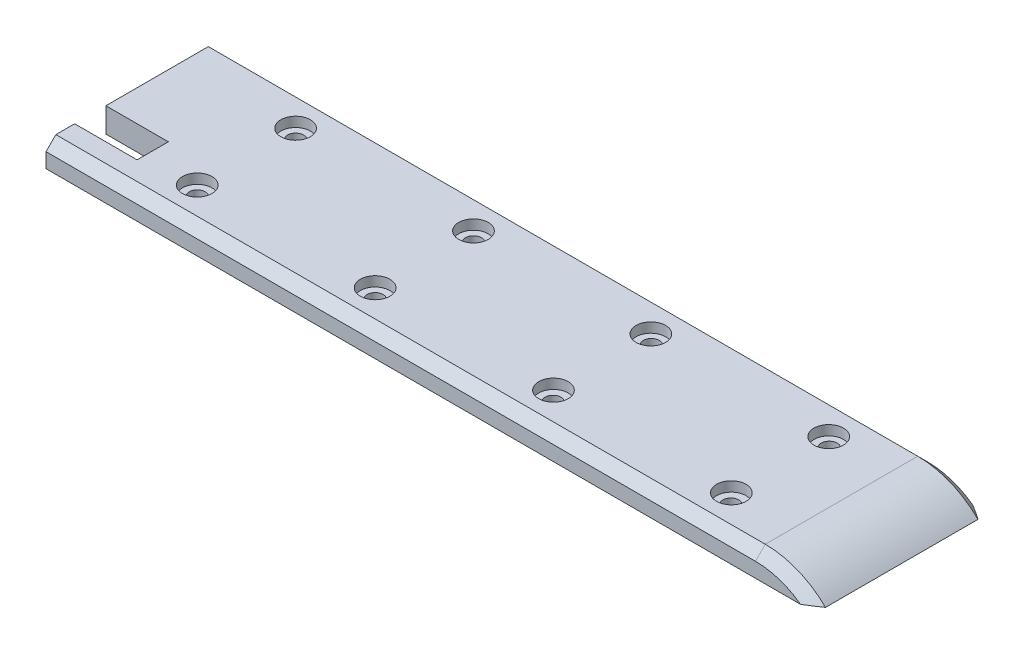
ISO-10303-21;
HEADER;
FILE_DESCRIPTION(('STEP AP214'),'2;1');
FILE_NAME('part.step','',(''),(''),'','','');
FILE_SCHEMA(('AUTOMOTIVE_DESIGN { 1 0 10303 214 1 1 1 1 }'));
ENDSEC;
DATA;
#1=APPLICATION_CONTEXT('core data for automotive mechanical design processes');
#2=APPLICATION_PROTOCOL_DEFINITION('international standard','automotive_design',2000,#1);
#3=PRODUCT_CONTEXT('',#1,'mechanical');
#4=PRODUCT('Part','Part','',(#3));
#5=PRODUCT_RELATED_PRODUCT_CATEGORY('part','',(#4));
#6=PRODUCT_DEFINITION_FORMATION('','',#4);
#7=PRODUCT_DEFINITION_CONTEXT('part definition',#1,'design');
#8=PRODUCT_DEFINITION('design','',#6,#7);
#9=PRODUCT_DEFINITION_SHAPE('','',#8);
#10=(LENGTH_UNIT() NAMED_UNIT(*) SI_UNIT(.MILLI.,.METRE.));
#11=(NAMED_UNIT(*) PLANE_ANGLE_UNIT() SI_UNIT($,.RADIAN.));
#12=(NAMED_UNIT(*) SI_UNIT($,.STERADIAN.) SOLID_ANGLE_UNIT());
#13=UNCERTAINTY_MEASURE_WITH_UNIT(LENGTH_MEASURE(1.E-05),#10,'distance_accuracy_value','');
#14=(GEOMETRIC_REPRESENTATION_CONTEXT(3) GLOBAL_UNCERTAINTY_ASSIGNED_CONTEXT((#13)) GLOBAL_UNIT_ASSIGNED_CONTEXT((#10,
#11,#12)) REPRESENTATION_CONTEXT('',''));
#15=CARTESIAN_POINT('',(0.,0.,0.));
#16=DIRECTION('',(0.,0.,1.));
#17=DIRECTION('',(1.,0.,0.));
#18=AXIS2_PLACEMENT_3D('',#15,#16,#17);
#19=CARTESIAN_POINT('',(-69.2474487139159,12.5,-17.5));
#20=DIRECTION('',(1.,0.,0.));
#21=DIRECTION('',(0.,0.,-1.));
#22=AXIS2_PLACEMENT_3D('',#19,#20,#21);
#23=PLANE('',#22);
#24=DIRECTION('',(0.,0.,1.));
#25=VECTOR('',#24,1.);
#26=CARTESIAN_POINT('',(-69.2474487139159,12.5,-17.5));
#27=LINE('',#26,#25);
#28=CARTESIAN_POINT('',(-69.2474487139159,12.5,-17.5));
#29=VERTEX_POINT('',#28);
#30=CARTESIAN_POINT('',(-69.2474487139159,12.5,5.32500000000039));
#31=VERTEX_POINT('',#30);
#32=EDGE_CURVE('E145',#29,#31,#27,.T.);
#33=ORIENTED_EDGE('',*,*,#32,.T.);
#34=DIRECTION('',(0.,1.,0.));
#35=VECTOR('',#34,1.);
#36=CARTESIAN_POINT('',(-69.2474487139159,-1.69903165712365,5.32500000000039));
#37=LINE('',#36,#35);
#38=CARTESIAN_POINT('',(-69.2474487139159,17.5,5.32500000000039));
#39=VERTEX_POINT('',#38);
#40=EDGE_CURVE('E502',#31,#39,#37,.T.);
#41=ORIENTED_EDGE('',*,*,#40,.T.);
#42=DIRECTION('',(0.,0.,1.));
#43=VECTOR('',#42,1.);
#44=CARTESIAN_POINT('',(-69.2474487139159,17.5,-17.5));
#45=LINE('',#44,#43);
#46=CARTESIAN_POINT('',(-69.2474487139159,17.5,-15.5));
#47=VERTEX_POINT('',#46);
#48=EDGE_CURVE('E144',#47,#39,#45,.T.);
#49=ORIENTED_EDGE('',*,*,#48,.F.);
#50=DIRECTION('',(0.,0.70710678118655,0.707106781186545));
#51=VECTOR('',#50,1.);
#52=CARTESIAN_POINT('',(-69.2474487139159,17.5,-15.5));
#53=LINE('',#52,#51);
#54=CARTESIAN_POINT('',(-69.2474487139159,15.5,-17.5));
#55=VERTEX_POINT('',#54);
#56=EDGE_CURVE('E345',#47,#55,#53,.F.);
#57=ORIENTED_EDGE('',*,*,#56,.T.);
#58=DIRECTION('',(0.,1.,0.));
#59=VECTOR('',#58,1.);
#60=CARTESIAN_POINT('',(-69.2474487139159,12.5,-17.5));
#61=LINE('',#60,#59);
#62=EDGE_CURVE('E337',#29,#55,#61,.T.);
#63=ORIENTED_EDGE('',*,*,#62,.F.);
#64=EDGE_LOOP('',(#33,#41,#49,#57,#63));
#65=FACE_BOUND('',#64,.T.);
#66=ADVANCED_FACE('F35',(#65),#23,.F.);
#67=CARTESIAN_POINT('',(62.5000000000001,22.0961940777126,10.));
#68=DIRECTION('',(0.,-1.,0.));
#69=DIRECTION('',(1.,0.,0.));
#70=AXIS2_PLACEMENT_3D('',#67,#68,#69);
#71=CYLINDRICAL_SURFACE('',#70,1.625);
#72=CARTESIAN_POINT('',(62.5000000000001,12.5,10.));
#73=DIRECTION('',(0.,1.,0.));
#74=DIRECTION('',(1.,0.,0.));
#75=AXIS2_PLACEMENT_3D('',#72,#73,#74);
#76=CIRCLE('',#75,1.625);
#77=CARTESIAN_POINT('',(64.1250000000001,12.5,10.));
#78=VERTEX_POINT('',#77);
#79=EDGE_CURVE('E194',#78,#78,#76,.T.);
#80=ORIENTED_EDGE('',*,*,#79,.F.);
#81=EDGE_LOOP('',(#80));
#82=FACE_BOUND('',#81,.T.);
#83=CARTESIAN_POINT('',(62.5000000000001,15.5,10.));
#84=DIRECTION('',(0.,1.,0.));
#85=DIRECTION('',(-1.,0.,0.));
#86=AXIS2_PLACEMENT_3D('',#83,#84,#85);
#87=CIRCLE('',#86,1.625);
#88=CARTESIAN_POINT('',(60.8750000000001,15.5,10.));
#89=VERTEX_POINT('',#88);
#90=EDGE_CURVE('E191',#89,#89,#87,.T.);
#91=ORIENTED_EDGE('',*,*,#90,.T.);
#92=EDGE_LOOP('',(#91));
#93=FACE_BOUND('',#92,.T.);
#94=ADVANCED_FACE('F252',(#82,#93),#71,.F.);
#95=CARTESIAN_POINT('',(26.3333333333334,22.0961940777126,9.99999999999997));
#96=DIRECTION('',(0.,-1.,0.));
#97=DIRECTION('',(1.,0.,0.));
#98=AXIS2_PLACEMENT_3D('',#95,#96,#97);
#99=CYLINDRICAL_SURFACE('',#98,1.625);
#100=CARTESIAN_POINT('',(26.3333333333334,12.5,9.99999999999997));
#101=DIRECTION('',(0.,1.,0.));
#102=DIRECTION('',(1.,0.,0.));
#103=AXIS2_PLACEMENT_3D('',#100,#101,#102);
#104=CIRCLE('',#103,1.625);
#105=CARTESIAN_POINT('',(27.9583333333334,12.5,9.99999999999997));
#106=VERTEX_POINT('',#105);
#107=EDGE_CURVE('E380',#106,#106,#104,.T.);
#108=ORIENTED_EDGE('',*,*,#107,.F.);
#109=EDGE_LOOP('',(#108));
#110=FACE_BOUND('',#109,.T.);
#111=CARTESIAN_POINT('',(26.3333333333334,15.5,9.99999999999997));
#112=DIRECTION('',(0.,1.,0.));
#113=DIRECTION('',(-1.,0.,0.));
#114=AXIS2_PLACEMENT_3D('',#111,#112,#113);
#115=CIRCLE('',#114,1.625);
#116=CARTESIAN_POINT('',(24.7083333333334,15.5,9.99999999999997));
#117=VERTEX_POINT('',#116);
#118=EDGE_CURVE('E188',#117,#117,#115,.T.);
#119=ORIENTED_EDGE('',*,*,#118,.T.);
#120=EDGE_LOOP('',(#119));
#121=FACE_BOUND('',#120,.T.);
#122=ADVANCED_FACE('F258',(#110,#121),#99,.F.);
#123=CARTESIAN_POINT('',(-9.83333333333332,22.0961940777126,10.));
#124=DIRECTION('',(0.,-1.,0.));
#125=DIRECTION('',(1.,0.,0.));
#126=AXIS2_PLACEMENT_3D('',#123,#124,#125);
#127=CYLINDRICAL_SURFACE('',#126,1.625);
#128=CARTESIAN_POINT('',(-9.83333333333332,12.5,10.));
#129=DIRECTION('',(0.,1.,0.));
#130=DIRECTION('',(1.,0.,0.));
#131=AXIS2_PLACEMENT_3D('',#128,#129,#130);
#132=CIRCLE('',#131,1.625);
#133=CARTESIAN_POINT('',(-8.20833333333332,12.5,10.));
#134=VERTEX_POINT('',#133);
#135=EDGE_CURVE('E323',#134,#134,#132,.T.);
#136=ORIENTED_EDGE('',*,*,#135,.F.);
#137=EDGE_LOOP('',(#136));
#138=FACE_BOUND('',#137,.T.);
#139=CARTESIAN_POINT('',(-9.83333333333332,15.5,10.));
#140=DIRECTION('',(0.,1.,0.));
#141=DIRECTION('',(-1.,0.,0.));
#142=AXIS2_PLACEMENT_3D('',#139,#140,#141);
#143=CIRCLE('',#142,1.625);
#144=CARTESIAN_POINT('',(-11.4583333333333,15.5,10.));
#145=VERTEX_POINT('',#144);
#146=EDGE_CURVE('E184',#145,#145,#143,.T.);
#147=ORIENTED_EDGE('',*,*,#146,.T.);
#148=EDGE_LOOP('',(#147));
#149=FACE_BOUND('',#148,.T.);
#150=ADVANCED_FACE('F433',(#138,#149),#127,.F.);
#151=CARTESIAN_POINT('',(-46.,22.0961940777126,10.));
#152=DIRECTION('',(0.,-1.,0.));
#153=DIRECTION('',(1.,0.,0.));
#154=AXIS2_PLACEMENT_3D('',#151,#152,#153);
#155=CYLINDRICAL_SURFACE('',#154,1.625);
#156=CARTESIAN_POINT('',(-46.,12.5,10.));
#157=DIRECTION('',(0.,1.,0.));
#158=DIRECTION('',(1.,0.,0.));
#159=AXIS2_PLACEMENT_3D('',#156,#157,#158);
#160=CIRCLE('',#159,1.625);
#161=CARTESIAN_POINT('',(-44.375,12.5,10.));
#162=VERTEX_POINT('',#161);
#163=EDGE_CURVE('E318',#162,#162,#160,.T.);
#164=ORIENTED_EDGE('',*,*,#163,.F.);
#165=EDGE_LOOP('',(#164));
#166=FACE_BOUND('',#165,.T.);
#167=CARTESIAN_POINT('',(-46.,15.5,10.));
#168=DIRECTION('',(0.,1.,0.));
#169=DIRECTION('',(-1.,0.,0.));
#170=AXIS2_PLACEMENT_3D('',#167,#168,#169);
#171=CIRCLE('',#170,1.625);
#172=CARTESIAN_POINT('',(-47.625,15.5,10.));
#173=VERTEX_POINT('',#172);
#174=EDGE_CURVE('E181',#173,#173,#171,.T.);
#175=ORIENTED_EDGE('',*,*,#174,.T.);
#176=EDGE_LOOP('',(#175));
#177=FACE_BOUND('',#176,.T.);
#178=ADVANCED_FACE('F428',(#166,#177),#155,.F.);
#179=CARTESIAN_POINT('',(62.5000000000001,22.0961940777126,-10.));
#180=DIRECTION('',(0.,-1.,0.));
#181=DIRECTION('',(1.,0.,0.));
#182=AXIS2_PLACEMENT_3D('',#179,#180,#181);
#183=CYLINDRICAL_SURFACE('',#182,1.625);
#184=CARTESIAN_POINT('',(62.5000000000001,12.5,-10.));
#185=DIRECTION('',(0.,-1.,0.));
#186=DIRECTION('',(1.,0.,0.));
#187=AXIS2_PLACEMENT_3D('',#184,#185,#186);
#188=CIRCLE('',#187,1.625);
#189=CARTESIAN_POINT('',(64.1250000000001,12.5,-10.));
#190=VERTEX_POINT('',#189);
#191=EDGE_CURVE('E180',#190,#190,#188,.T.);
#192=ORIENTED_EDGE('',*,*,#191,.T.);
#193=EDGE_LOOP('',(#192));
#194=FACE_BOUND('',#193,.T.);
#195=CARTESIAN_POINT('',(62.5000000000001,15.5,-10.));
#196=DIRECTION('',(0.,1.,0.));
#197=DIRECTION('',(-1.,0.,0.));
#198=AXIS2_PLACEMENT_3D('',#195,#196,#197);
#199=CIRCLE('',#198,1.625);
#200=CARTESIAN_POINT('',(60.8750000000001,15.5,-10.));
#201=VERTEX_POINT('',#200);
#202=EDGE_CURVE('E177',#201,#201,#199,.F.);
#203=ORIENTED_EDGE('',*,*,#202,.F.);
#204=EDGE_LOOP('',(#203));
#205=FACE_BOUND('',#204,.T.);
#206=ADVANCED_FACE('F425',(#194,#205),#183,.F.);
#207=CARTESIAN_POINT('',(26.3333333333334,22.0961940777126,-9.99999999999997));
#208=DIRECTION('',(0.,-1.,0.));
#209=DIRECTION('',(1.,0.,0.));
#210=AXIS2_PLACEMENT_3D('',#207,#208,#209);
#211=CYLINDRICAL_SURFACE('',#210,1.625);
#212=CARTESIAN_POINT('',(26.3333333333334,12.5,-9.99999999999997));
#213=DIRECTION('',(0.,-1.,0.));
#214=DIRECTION('',(1.,0.,0.));
#215=AXIS2_PLACEMENT_3D('',#212,#213,#214);
#216=CIRCLE('',#215,1.625);
#217=CARTESIAN_POINT('',(27.9583333333334,12.5,-9.99999999999997));
#218=VERTEX_POINT('',#217);
#219=EDGE_CURVE('E333',#218,#218,#216,.T.);
#220=ORIENTED_EDGE('',*,*,#219,.T.);
#221=EDGE_LOOP('',(#220));
#222=FACE_BOUND('',#221,.T.);
#223=CARTESIAN_POINT('',(26.3333333333334,15.5,-9.99999999999997));
#224=DIRECTION('',(0.,1.,0.));
#225=DIRECTION('',(-1.,0.,0.));
#226=AXIS2_PLACEMENT_3D('',#223,#224,#225);
#227=CIRCLE('',#226,1.625);
#228=CARTESIAN_POINT('',(24.7083333333334,15.5,-9.99999999999997));
#229=VERTEX_POINT('',#228);
#230=EDGE_CURVE('E174',#229,#229,#227,.F.);
#231=ORIENTED_EDGE('',*,*,#230,.F.);
#232=EDGE_LOOP('',(#231));
#233=FACE_BOUND('',#232,.T.);
#234=ADVANCED_FACE('F422',(#222,#233),#211,.F.);
#235=CARTESIAN_POINT('',(-9.83333333333332,22.0961940777126,-10.));
#236=DIRECTION('',(0.,-1.,0.));
#237=DIRECTION('',(1.,0.,0.));
#238=AXIS2_PLACEMENT_3D('',#235,#236,#237);
#239=CYLINDRICAL_SURFACE('',#238,1.625);
#240=CARTESIAN_POINT('',(-9.83333333333332,12.5,-10.));
#241=DIRECTION('',(0.,-1.,0.));
#242=DIRECTION('',(1.,0.,0.));
#243=AXIS2_PLACEMENT_3D('',#240,#241,#242);
#244=CIRCLE('',#243,1.625);
#245=CARTESIAN_POINT('',(-8.20833333333332,12.5,-10.));
#246=VERTEX_POINT('',#245);
#247=EDGE_CURVE('E330',#246,#246,#244,.T.);
#248=ORIENTED_EDGE('',*,*,#247,.T.);
#249=EDGE_LOOP('',(#248));
#250=FACE_BOUND('',#249,.T.);
#251=CARTESIAN_POINT('',(-9.83333333333332,15.5,-10.));
#252=DIRECTION('',(0.,1.,0.));
#253=DIRECTION('',(-1.,0.,0.));
#254=AXIS2_PLACEMENT_3D('',#251,#252,#253);
#255=CIRCLE('',#254,1.625);
#256=CARTESIAN_POINT('',(-11.4583333333333,15.5,-10.));
#257=VERTEX_POINT('',#256);
#258=EDGE_CURVE('E170',#257,#257,#255,.F.);
#259=ORIENTED_EDGE('',*,*,#258,.F.);
#260=EDGE_LOOP('',(#259));
#261=FACE_BOUND('',#260,.T.);
#262=ADVANCED_FACE('F418',(#250,#261),#239,.F.);
#263=CARTESIAN_POINT('',(-46.,22.0961940777126,-10.));
#264=DIRECTION('',(0.,-1.,0.));
#265=DIRECTION('',(1.,0.,0.));
#266=AXIS2_PLACEMENT_3D('',#263,#264,#265);
#267=CYLINDRICAL_SURFACE('',#266,1.625);
#268=CARTESIAN_POINT('',(-46.,12.5,-10.));
#269=DIRECTION('',(0.,-1.,0.));
#270=DIRECTION('',(1.,0.,0.));
#271=AXIS2_PLACEMENT_3D('',#268,#269,#270);
#272=CIRCLE('',#271,1.625);
#273=CARTESIAN_POINT('',(-44.375,12.5,-10.));
#274=VERTEX_POINT('',#273);
#275=EDGE_CURVE('E327',#274,#274,#272,.T.);
#276=ORIENTED_EDGE('',*,*,#275,.T.);
#277=EDGE_LOOP('',(#276));
#278=FACE_BOUND('',#277,.T.);
#279=CARTESIAN_POINT('',(-46.,15.5,-10.));
#280=DIRECTION('',(0.,1.,0.));
#281=DIRECTION('',(-1.,0.,0.));
#282=AXIS2_PLACEMENT_3D('',#279,#280,#281);
#283=CIRCLE('',#282,1.625);
#284=CARTESIAN_POINT('',(-47.625,15.5,-10.));
#285=VERTEX_POINT('',#284);
#286=EDGE_CURVE('E167',#285,#285,#283,.F.);
#287=ORIENTED_EDGE('',*,*,#286,.F.);
#288=EDGE_LOOP('',(#287));
#289=FACE_BOUND('',#288,.T.);
#290=ADVANCED_FACE('F227',(#278,#289),#267,.F.);
#291=CARTESIAN_POINT('',(87.2474487139159,12.5,17.5));
#292=DIRECTION('',(0.,1.,0.));
#293=DIRECTION('',(-1.,0.,0.));
#294=AXIS2_PLACEMENT_3D('',#291,#292,#293);
#295=PLANE('',#294);
#296=ORIENTED_EDGE('',*,*,#163,.T.);
#297=EDGE_LOOP('',(#296));
#298=FACE_BOUND('',#297,.T.);
#299=ORIENTED_EDGE('',*,*,#135,.T.);
#300=EDGE_LOOP('',(#299));
#301=FACE_BOUND('',#300,.T.);
#302=ORIENTED_EDGE('',*,*,#107,.T.);
#303=EDGE_LOOP('',(#302));
#304=FACE_BOUND('',#303,.T.);
#305=ORIENTED_EDGE('',*,*,#79,.T.);
#306=EDGE_LOOP('',(#305));
#307=FACE_BOUND('',#306,.T.);
#308=ORIENTED_EDGE('',*,*,#275,.F.);
#309=EDGE_LOOP('',(#308));
#310=FACE_BOUND('',#309,.T.);
#311=ORIENTED_EDGE('',*,*,#247,.F.);
#312=EDGE_LOOP('',(#311));
#313=FACE_BOUND('',#312,.T.);
#314=ORIENTED_EDGE('',*,*,#219,.F.);
#315=EDGE_LOOP('',(#314));
#316=FACE_BOUND('',#315,.T.);
#317=ORIENTED_EDGE('',*,*,#191,.F.);
#318=EDGE_LOOP('',(#317));
#319=FACE_BOUND('',#318,.T.);
#320=DIRECTION('',(0.,0.,1.));
#321=VECTOR('',#320,1.);
#322=CARTESIAN_POINT('',(-56.5474487139159,12.5,5.32500000000039));
#323=LINE('',#322,#321);
#324=CARTESIAN_POINT('',(-56.5474487139159,12.5,5.32500000000039));
#325=VERTEX_POINT('',#324);
#326=CARTESIAN_POINT('',(-56.5474487139159,12.5,11.6750000000004));
#327=VERTEX_POINT('',#326);
#328=EDGE_CURVE('E361',#325,#327,#323,.T.);
#329=ORIENTED_EDGE('',*,*,#328,.F.);
#330=DIRECTION('',(1.,0.,0.));
#331=VECTOR('',#330,1.);
#332=CARTESIAN_POINT('',(-69.2474487139159,12.5,5.32500000000039));
#333=LINE('',#332,#331);
#334=EDGE_CURVE('E359',#31,#325,#333,.T.);
#335=ORIENTED_EDGE('',*,*,#334,.F.);
#336=ORIENTED_EDGE('',*,*,#32,.F.);
#337=DIRECTION('',(1.,0.,0.));
#338=VECTOR('',#337,1.);
#339=CARTESIAN_POINT('',(87.2474487139159,12.5,-17.5));
#340=LINE('',#339,#338);
#341=CARTESIAN_POINT('',(84.1651513899117,12.5,-17.5));
#342=VERTEX_POINT('',#341);
#343=EDGE_CURVE('E147',#29,#342,#340,.T.);
#344=ORIENTED_EDGE('',*,*,#343,.T.);
#345=CARTESIAN_POINT('',(84.1651513899117,12.5,-17.5));
#346=CARTESIAN_POINT('',(84.4288354658246,12.5,-17.3440573963148));
#347=CARTESIAN_POINT('',(84.6906080472939,12.5,-17.1849216002896));
#348=CARTESIAN_POINT('',(85.210568351371,12.5,-16.8610986444784));
#349=CARTESIAN_POINT('',(85.4687573416288,12.5,-16.6964135222086));
#350=CARTESIAN_POINT('',(85.9819624339059,12.5,-16.3622237420843));
#351=CARTESIAN_POINT('',(86.2369787479366,12.5,-16.1927194087836));
#352=CARTESIAN_POINT('',(86.7442419059624,12.5,-15.849416953267));
#353=CARTESIAN_POINT('',(86.9964877108866,12.5,-15.6756172945295));
#354=CARTESIAN_POINT('',(87.2474487139159,12.5,-15.5));
#355=B_SPLINE_CURVE_WITH_KNOTS('',3,(#345,#346,#347,#348,#349,#350,#351,#352,#353,#354),
.UNSPECIFIED.,.F.,.F.,(4,2,2,2,4),(0.,0.91898453449396,1.83763525024477,2.756224244583,
3.67514673333098),.UNSPECIFIED.);
#356=CARTESIAN_POINT('',(87.2474487139159,12.5,-15.5));
#357=VERTEX_POINT('',#356);
#358=EDGE_CURVE('E204',#342,#357,#355,.T.);
#359=ORIENTED_EDGE('',*,*,#358,.T.);
#360=DIRECTION('',(0.,0.,-1.));
#361=VECTOR('',#360,1.);
#362=CARTESIAN_POINT('',(87.2474487139159,12.5,17.5));
#363=LINE('',#362,#361);
#364=CARTESIAN_POINT('',(87.2474487139159,12.5,15.5));
#365=VERTEX_POINT('',#364);
#366=EDGE_CURVE('E163',#365,#357,#363,.T.);
#367=ORIENTED_EDGE('',*,*,#366,.F.);
#368=CARTESIAN_POINT('',(87.2474487139159,12.5,15.5));
#369=CARTESIAN_POINT('',(86.9964877108866,12.5,15.6756172945295));
#370=CARTESIAN_POINT('',(86.7442419059624,12.5,15.849416953267));
#371=CARTESIAN_POINT('',(86.2369787479366,12.5,16.1927194087836));
#372=CARTESIAN_POINT('',(85.9819624339059,12.5,16.3622237420843));
#373=CARTESIAN_POINT('',(85.4687573416287,12.5,16.6964135222086));
#374=CARTESIAN_POINT('',(85.210568351371,12.5,16.8610986444784));
#375=CARTESIAN_POINT('',(84.6906080472939,12.5,17.1849216002896));
#376=CARTESIAN_POINT('',(84.4288354658246,12.5,17.3440573963148));
#377=CARTESIAN_POINT('',(84.1651513899116,12.5,17.5));
#378=B_SPLINE_CURVE_WITH_KNOTS('',3,(#368,#369,#370,#371,#372,#373,#374,#375,#376,#377),
.UNSPECIFIED.,.F.,.F.,(4,2,2,2,4),(0.,0.918922488747956,1.83751148308623,2.75616219883705,
3.67514673333101),.UNSPECIFIED.);
#379=CARTESIAN_POINT('',(84.1651513899117,12.5,17.5));
#380=VERTEX_POINT('',#379);
#381=EDGE_CURVE('E211',#365,#380,#378,.T.);
#382=ORIENTED_EDGE('',*,*,#381,.T.);
#383=DIRECTION('',(1.,0.,0.));
#384=VECTOR('',#383,1.);
#385=CARTESIAN_POINT('',(87.2474487139159,12.5,17.5));
#386=LINE('',#385,#384);
#387=CARTESIAN_POINT('',(-69.2474487139159,12.5,17.5));
#388=VERTEX_POINT('',#387);
#389=EDGE_CURVE('E155',#388,#380,#386,.T.);
#390=ORIENTED_EDGE('',*,*,#389,.F.);
#391=CARTESIAN_POINT('',(-69.2474487139159,12.5,11.6750000000004));
#392=VERTEX_POINT('',#391);
#393=EDGE_CURVE('E149',#392,#388,#27,.T.);
#394=ORIENTED_EDGE('',*,*,#393,.F.);
#395=DIRECTION('',(-1.,0.,0.));
#396=VECTOR('',#395,1.);
#397=CARTESIAN_POINT('',(-69.2474487139159,12.5,11.6750000000004));
#398=LINE('',#397,#396);
#399=EDGE_CURVE('E53',#327,#392,#398,.T.);
#400=ORIENTED_EDGE('',*,*,#399,.F.);
#401=EDGE_LOOP('',(#329,#335,#336,#344,#359,#367,#382,#390,#394,#400));
#402=FACE_BOUND('',#401,.T.);
#403=ADVANCED_FACE('F222',(#298,#301,#304,#307,#310,#313,#316,#319,#402),#295,.F.);
#404=CARTESIAN_POINT('',(75.,0.,17.5));
#405=DIRECTION('',(0.,0.,-1.));
#406=DIRECTION('',(-1.,0.,0.));
#407=AXIS2_PLACEMENT_3D('',#404,#405,#406);
#408=CYLINDRICAL_SURFACE('',#407,17.5);
#409=DIRECTION('',(0.,0.,-1.));
#410=VECTOR('',#409,1.);
#411=CARTESIAN_POINT('',(75.,17.5,17.5));
#412=LINE('',#411,#410);
#413=CARTESIAN_POINT('',(75.,17.5,15.5));
#414=VERTEX_POINT('',#413);
#415=CARTESIAN_POINT('',(75.,17.5,-15.5));
#416=VERTEX_POINT('',#415);
#417=EDGE_CURVE('E158',#414,#416,#412,.T.);
#418=ORIENTED_EDGE('',*,*,#417,.F.);
#419=CARTESIAN_POINT('',(75.,0.,15.5));
#420=DIRECTION('',(0.,0.,1.));
#421=DIRECTION('',(1.,0.,0.));
#422=AXIS2_PLACEMENT_3D('',#419,#420,#421);
#423=CIRCLE('',#422,17.5);
#424=EDGE_CURVE('E202',#414,#365,#423,.F.);
#425=ORIENTED_EDGE('',*,*,#424,.T.);
#426=ORIENTED_EDGE('',*,*,#366,.T.);
#427=CARTESIAN_POINT('',(75.,0.,-15.5));
#428=DIRECTION('',(0.,0.,1.));
#429=DIRECTION('',(1.,0.,0.));
#430=AXIS2_PLACEMENT_3D('',#427,#428,#429);
#431=CIRCLE('',#430,17.5);
#432=EDGE_CURVE('E199',#357,#416,#431,.T.);
#433=ORIENTED_EDGE('',*,*,#432,.T.);
#434=EDGE_LOOP('',(#418,#425,#426,#433));
#435=FACE_BOUND('',#434,.T.);
#436=ADVANCED_FACE('F226',(#435),#408,.T.);
#437=CARTESIAN_POINT('',(-75.,17.5,17.5));
#438=DIRECTION('',(0.,-1.,0.));
#439=DIRECTION('',(1.,0.,0.));
#440=AXIS2_PLACEMENT_3D('',#437,#438,#439);
#441=PLANE('',#440);
#442=CARTESIAN_POINT('',(62.5000000000004,17.5,9.8999999999998));
#443=DIRECTION('',(0.,-1.,0.));
#444=DIRECTION('',(-1.,0.,0.));
#445=AXIS2_PLACEMENT_3D('',#442,#443,#444);
#446=CIRCLE('',#445,3.00000000000001);
#447=CARTESIAN_POINT('',(59.5000000000004,17.5,9.8999999999998));
#448=VERTEX_POINT('',#447);
#449=EDGE_CURVE('E288',#448,#448,#446,.T.);
#450=ORIENTED_EDGE('',*,*,#449,.T.);
#451=EDGE_LOOP('',(#450));
#452=FACE_BOUND('',#451,.T.);
#453=CARTESIAN_POINT('',(26.3333333333337,17.5,9.8999999999996));
#454=DIRECTION('',(0.,-1.,0.));
#455=DIRECTION('',(-1.,0.,0.));
#456=AXIS2_PLACEMENT_3D('',#453,#454,#455);
#457=CIRCLE('',#456,3.);
#458=CARTESIAN_POINT('',(23.3333333333337,17.5,9.8999999999996));
#459=VERTEX_POINT('',#458);
#460=EDGE_CURVE('E292',#459,#459,#457,.T.);
#461=ORIENTED_EDGE('',*,*,#460,.T.);
#462=EDGE_LOOP('',(#461));
#463=FACE_BOUND('',#462,.T.);
#464=CARTESIAN_POINT('',(-9.83333333333332,17.5,10.));
#465=DIRECTION('',(0.,-1.,0.));
#466=DIRECTION('',(-1.,0.,0.));
#467=AXIS2_PLACEMENT_3D('',#464,#465,#466);
#468=CIRCLE('',#467,3.);
#469=CARTESIAN_POINT('',(-12.8333333333333,17.5,10.));
#470=VERTEX_POINT('',#469);
#471=EDGE_CURVE('E296',#470,#470,#468,.T.);
#472=ORIENTED_EDGE('',*,*,#471,.T.);
#473=EDGE_LOOP('',(#472));
#474=FACE_BOUND('',#473,.T.);
#475=CARTESIAN_POINT('',(-46.,17.5,10.));
#476=DIRECTION('',(0.,-1.,0.));
#477=DIRECTION('',(-1.,0.,0.));
#478=AXIS2_PLACEMENT_3D('',#475,#476,#477);
#479=CIRCLE('',#478,3.);
#480=CARTESIAN_POINT('',(-49.,17.5,10.));
#481=VERTEX_POINT('',#480);
#482=EDGE_CURVE('E300',#481,#481,#479,.T.);
#483=ORIENTED_EDGE('',*,*,#482,.T.);
#484=EDGE_LOOP('',(#483));
#485=FACE_BOUND('',#484,.T.);
#486=CARTESIAN_POINT('',(62.5000000000004,17.5,-9.8999999999998));
#487=DIRECTION('',(0.,1.,0.));
#488=DIRECTION('',(-1.,0.,0.));
#489=AXIS2_PLACEMENT_3D('',#486,#487,#488);
#490=CIRCLE('',#489,3.00000000000001);
#491=CARTESIAN_POINT('',(59.5000000000004,17.5,-9.8999999999998));
#492=VERTEX_POINT('',#491);
#493=EDGE_CURVE('E304',#492,#492,#490,.T.);
#494=ORIENTED_EDGE('',*,*,#493,.F.);
#495=EDGE_LOOP('',(#494));
#496=FACE_BOUND('',#495,.T.);
#497=CARTESIAN_POINT('',(26.3333333333337,17.5,-9.8999999999996));
#498=DIRECTION('',(0.,1.,0.));
#499=DIRECTION('',(-1.,0.,0.));
#500=AXIS2_PLACEMENT_3D('',#497,#498,#499);
#501=CIRCLE('',#500,3.);
#502=CARTESIAN_POINT('',(23.3333333333337,17.5,-9.8999999999996));
#503=VERTEX_POINT('',#502);
#504=EDGE_CURVE('E308',#503,#503,#501,.T.);
#505=ORIENTED_EDGE('',*,*,#504,.F.);
#506=EDGE_LOOP('',(#505));
#507=FACE_BOUND('',#506,.T.);
#508=CARTESIAN_POINT('',(-9.83333333333332,17.5,-10.));
#509=DIRECTION('',(0.,1.,0.));
#510=DIRECTION('',(-1.,0.,0.));
#511=AXIS2_PLACEMENT_3D('',#508,#509,#510);
#512=CIRCLE('',#511,3.);
#513=CARTESIAN_POINT('',(-12.8333333333333,17.5,-10.));
#514=VERTEX_POINT('',#513);
#515=EDGE_CURVE('E312',#514,#514,#512,.T.);
#516=ORIENTED_EDGE('',*,*,#515,.F.);
#517=EDGE_LOOP('',(#516));
#518=FACE_BOUND('',#517,.T.);
#519=CARTESIAN_POINT('',(-46.,17.5,-10.));
#520=DIRECTION('',(0.,1.,0.));
#521=DIRECTION('',(-1.,0.,0.));
#522=AXIS2_PLACEMENT_3D('',#519,#520,#521);
#523=CIRCLE('',#522,3.);
#524=CARTESIAN_POINT('',(-49.,17.5,-10.));
#525=VERTEX_POINT('',#524);
#526=EDGE_CURVE('E315',#525,#525,#523,.T.);
#527=ORIENTED_EDGE('',*,*,#526,.F.);
#528=EDGE_LOOP('',(#527));
#529=FACE_BOUND('',#528,.T.);
#530=ORIENTED_EDGE('',*,*,#48,.T.);
#531=DIRECTION('',(-1.,0.,0.));
#532=VECTOR('',#531,1.);
#533=CARTESIAN_POINT('',(-69.2474487139159,17.5,5.32500000000039));
#534=LINE('',#533,#532);
#535=CARTESIAN_POINT('',(-56.5474487139159,17.5,5.32500000000039));
#536=VERTEX_POINT('',#535);
#537=EDGE_CURVE('E128',#536,#39,#534,.T.);
#538=ORIENTED_EDGE('',*,*,#537,.F.);
#539=DIRECTION('',(0.,0.,-1.));
#540=VECTOR('',#539,1.);
#541=CARTESIAN_POINT('',(-56.5474487139159,17.5,5.32500000000039));
#542=LINE('',#541,#540);
#543=CARTESIAN_POINT('',(-56.5474487139159,17.5,11.6750000000004));
#544=VERTEX_POINT('',#543);
#545=EDGE_CURVE('E137',#544,#536,#542,.T.);
#546=ORIENTED_EDGE('',*,*,#545,.F.);
#547=DIRECTION('',(1.,0.,0.));
#548=VECTOR('',#547,1.);
#549=CARTESIAN_POINT('',(-69.2474487139159,17.5,11.6750000000004));
#550=LINE('',#549,#548);
#551=CARTESIAN_POINT('',(-69.2474487139159,17.5,11.6750000000004));
#552=VERTEX_POINT('',#551);
#553=EDGE_CURVE('E122',#552,#544,#550,.T.);
#554=ORIENTED_EDGE('',*,*,#553,.F.);
#555=CARTESIAN_POINT('',(-69.2474487139159,17.5,15.5));
#556=VERTEX_POINT('',#555);
#557=EDGE_CURVE('E133',#552,#556,#45,.T.);
#558=ORIENTED_EDGE('',*,*,#557,.T.);
#559=DIRECTION('',(1.,0.,0.));
#560=VECTOR('',#559,1.);
#561=CARTESIAN_POINT('',(75.,17.5,15.5));
#562=LINE('',#561,#560);
#563=EDGE_CURVE('E343',#556,#414,#562,.T.);
#564=ORIENTED_EDGE('',*,*,#563,.T.);
#565=ORIENTED_EDGE('',*,*,#417,.T.);
#566=DIRECTION('',(-1.,0.,0.));
#567=VECTOR('',#566,1.);
#568=CARTESIAN_POINT('',(-75.,17.5,-15.5));
#569=LINE('',#568,#567);
#570=EDGE_CURVE('E344',#416,#47,#569,.T.);
#571=ORIENTED_EDGE('',*,*,#570,.T.);
#572=EDGE_LOOP('',(#530,#538,#546,#554,#558,#564,#565,#571));
#573=FACE_BOUND('',#572,.T.);
#574=ADVANCED_FACE('F132',(#452,#463,#474,#485,#496,#507,#518,#529,#573),#441,.F.);
#575=CARTESIAN_POINT('',(-75.,0.,17.5));
#576=DIRECTION('',(0.,0.,1.));
#577=DIRECTION('',(1.,0.,0.));
#578=AXIS2_PLACEMENT_3D('',#575,#576,#577);
#579=PLANE('',#578);
#580=ORIENTED_EDGE('',*,*,#389,.T.);
#581=CARTESIAN_POINT('',(75.,0.,17.5));
#582=DIRECTION('',(0.,0.,1.));
#583=DIRECTION('',(1.,0.,0.));
#584=AXIS2_PLACEMENT_3D('',#581,#582,#583);
#585=CIRCLE('',#584,15.5);
#586=CARTESIAN_POINT('',(75.,15.5,17.5));
#587=VERTEX_POINT('',#586);
#588=EDGE_CURVE('E196',#380,#587,#585,.T.);
#589=ORIENTED_EDGE('',*,*,#588,.T.);
#590=DIRECTION('',(-1.,0.,0.));
#591=VECTOR('',#590,1.);
#592=CARTESIAN_POINT('',(-69.2474487139159,15.5,17.5));
#593=LINE('',#592,#591);
#594=CARTESIAN_POINT('',(-69.2474487139159,15.5,17.5));
#595=VERTEX_POINT('',#594);
#596=EDGE_CURVE('E166',#587,#595,#593,.T.);
#597=ORIENTED_EDGE('',*,*,#596,.T.);
#598=DIRECTION('',(0.,1.,0.));
#599=VECTOR('',#598,1.);
#600=CARTESIAN_POINT('',(-69.2474487139159,12.5,17.5));
#601=LINE('',#600,#599);
#602=EDGE_CURVE('E152',#388,#595,#601,.T.);
#603=ORIENTED_EDGE('',*,*,#602,.F.);
#604=EDGE_LOOP('',(#580,#589,#597,#603));
#605=FACE_BOUND('',#604,.T.);
#606=ADVANCED_FACE('F273',(#605),#579,.T.);
#607=CARTESIAN_POINT('',(-75.,0.,-17.5));
#608=DIRECTION('',(0.,0.,1.));
#609=DIRECTION('',(1.,0.,0.));
#610=AXIS2_PLACEMENT_3D('',#607,#608,#609);
#611=PLANE('',#610);
#612=DIRECTION('',(1.,0.,0.));
#613=VECTOR('',#612,1.);
#614=CARTESIAN_POINT('',(-75.,15.5,-17.5));
#615=LINE('',#614,#613);
#616=CARTESIAN_POINT('',(75.,15.5,-17.5));
#617=VERTEX_POINT('',#616);
#618=EDGE_CURVE('E45',#55,#617,#615,.T.);
#619=ORIENTED_EDGE('',*,*,#618,.T.);
#620=CARTESIAN_POINT('',(75.,0.,-17.5));
#621=DIRECTION('',(0.,0.,1.));
#622=DIRECTION('',(1.,0.,0.));
#623=AXIS2_PLACEMENT_3D('',#620,#621,#622);
#624=CIRCLE('',#623,15.5);
#625=EDGE_CURVE('E11',#617,#342,#624,.F.);
#626=ORIENTED_EDGE('',*,*,#625,.T.);
#627=ORIENTED_EDGE('',*,*,#343,.F.);
#628=ORIENTED_EDGE('',*,*,#62,.T.);
#629=EDGE_LOOP('',(#619,#626,#627,#628));
#630=FACE_BOUND('',#629,.T.);
#631=ADVANCED_FACE('F265',(#630),#611,.F.);
#632=ORIENTED_EDGE('',*,*,#557,.F.);
#633=DIRECTION('',(0.,1.,0.));
#634=VECTOR('',#633,1.);
#635=CARTESIAN_POINT('',(-69.2474487139159,-1.69903165712365,11.6750000000004));
#636=LINE('',#635,#634);
#637=EDGE_CURVE('E119',#392,#552,#636,.T.);
#638=ORIENTED_EDGE('',*,*,#637,.F.);
#639=ORIENTED_EDGE('',*,*,#393,.T.);
#640=ORIENTED_EDGE('',*,*,#602,.T.);
#641=DIRECTION('',(0.,0.707106781186545,-0.70710678118655));
#642=VECTOR('',#641,1.);
#643=CARTESIAN_POINT('',(-69.2474487139159,15.5,17.5));
#644=LINE('',#643,#642);
#645=EDGE_CURVE('E142',#595,#556,#644,.T.);
#646=ORIENTED_EDGE('',*,*,#645,.T.);
#647=EDGE_LOOP('',(#632,#638,#639,#640,#646));
#648=FACE_BOUND('',#647,.T.);
#649=ADVANCED_FACE('F139',(#648),#23,.F.);
#650=CARTESIAN_POINT('',(-46.,15.5,-10.));
#651=DIRECTION('',(0.,1.,0.));
#652=DIRECTION('',(-1.,0.,0.));
#653=AXIS2_PLACEMENT_3D('',#650,#651,#652);
#654=PLANE('',#653);
#655=CARTESIAN_POINT('',(-46.,15.5,-10.));
#656=DIRECTION('',(0.,1.,0.));
#657=DIRECTION('',(-1.,0.,0.));
#658=AXIS2_PLACEMENT_3D('',#655,#656,#657);
#659=CIRCLE('',#658,3.);
#660=CARTESIAN_POINT('',(-49.,15.5,-10.));
#661=VERTEX_POINT('',#660);
#662=EDGE_CURVE('E317',#661,#661,#659,.T.);
#663=ORIENTED_EDGE('',*,*,#662,.T.);
#664=EDGE_LOOP('',(#663));
#665=FACE_BOUND('',#664,.T.);
#666=ORIENTED_EDGE('',*,*,#286,.T.);
#667=EDGE_LOOP('',(#666));
#668=FACE_BOUND('',#667,.T.);
#669=ADVANCED_FACE('F264',(#665,#668),#654,.T.);
#670=CARTESIAN_POINT('',(-46.,15.5,-10.));
#671=DIRECTION('',(0.,1.,0.));
#672=DIRECTION('',(-1.,0.,0.));
#673=AXIS2_PLACEMENT_3D('',#670,#671,#672);
#674=CYLINDRICAL_SURFACE('',#673,3.);
#675=ORIENTED_EDGE('',*,*,#662,.F.);
#676=EDGE_LOOP('',(#675));
#677=FACE_BOUND('',#676,.T.);
#678=ORIENTED_EDGE('',*,*,#526,.T.);
#679=EDGE_LOOP('',(#678));
#680=FACE_BOUND('',#679,.T.);
#681=ADVANCED_FACE('F270',(#677,#680),#674,.F.);
#682=CARTESIAN_POINT('',(-9.83333333333332,15.5,-10.));
#683=DIRECTION('',(0.,1.,0.));
#684=DIRECTION('',(-1.,0.,0.));
#685=AXIS2_PLACEMENT_3D('',#682,#683,#684);
#686=PLANE('',#685);
#687=CARTESIAN_POINT('',(-9.83333333333332,15.5,-10.));
#688=DIRECTION('',(0.,1.,0.));
#689=DIRECTION('',(-1.,0.,0.));
#690=AXIS2_PLACEMENT_3D('',#687,#688,#689);
#691=CIRCLE('',#690,3.);
#692=CARTESIAN_POINT('',(-12.8333333333333,15.5,-10.));
#693=VERTEX_POINT('',#692);
#694=EDGE_CURVE('E392',#693,#693,#691,.T.);
#695=ORIENTED_EDGE('',*,*,#694,.T.);
#696=EDGE_LOOP('',(#695));
#697=FACE_BOUND('',#696,.T.);
#698=ORIENTED_EDGE('',*,*,#258,.T.);
#699=EDGE_LOOP('',(#698));
#700=FACE_BOUND('',#699,.T.);
#701=ADVANCED_FACE('F398',(#697,#700),#686,.T.);
#702=CARTESIAN_POINT('',(-9.83333333333332,15.5,-10.));
#703=DIRECTION('',(0.,1.,0.));
#704=DIRECTION('',(-1.,0.,0.));
#705=AXIS2_PLACEMENT_3D('',#702,#703,#704);
#706=CYLINDRICAL_SURFACE('',#705,3.);
#707=ORIENTED_EDGE('',*,*,#694,.F.);
#708=EDGE_LOOP('',(#707));
#709=FACE_BOUND('',#708,.T.);
#710=ORIENTED_EDGE('',*,*,#515,.T.);
#711=EDGE_LOOP('',(#710));
#712=FACE_BOUND('',#711,.T.);
#713=ADVANCED_FACE('F395',(#709,#712),#706,.F.);
#714=CARTESIAN_POINT('',(26.3333333333337,15.5,-9.8999999999996));
#715=DIRECTION('',(0.,1.,0.));
#716=DIRECTION('',(-1.,0.,0.));
#717=AXIS2_PLACEMENT_3D('',#714,#715,#716);
#718=PLANE('',#717);
#719=CARTESIAN_POINT('',(26.3333333333337,15.5,-9.8999999999996));
#720=DIRECTION('',(0.,1.,0.));
#721=DIRECTION('',(-1.,0.,0.));
#722=AXIS2_PLACEMENT_3D('',#719,#720,#721);
#723=CIRCLE('',#722,3.);
#724=CARTESIAN_POINT('',(23.3333333333337,15.5,-9.8999999999996));
#725=VERTEX_POINT('',#724);
#726=EDGE_CURVE('E388',#725,#725,#723,.T.);
#727=ORIENTED_EDGE('',*,*,#726,.T.);
#728=EDGE_LOOP('',(#727));
#729=FACE_BOUND('',#728,.T.);
#730=ORIENTED_EDGE('',*,*,#230,.T.);
#731=EDGE_LOOP('',(#730));
#732=FACE_BOUND('',#731,.T.);
#733=ADVANCED_FACE('F397',(#729,#732),#718,.T.);
#734=CARTESIAN_POINT('',(26.3333333333337,15.5,-9.8999999999996));
#735=DIRECTION('',(0.,1.,0.));
#736=DIRECTION('',(-1.,0.,0.));
#737=AXIS2_PLACEMENT_3D('',#734,#735,#736);
#738=CYLINDRICAL_SURFACE('',#737,3.);
#739=ORIENTED_EDGE('',*,*,#726,.F.);
#740=EDGE_LOOP('',(#739));
#741=FACE_BOUND('',#740,.T.);
#742=ORIENTED_EDGE('',*,*,#504,.T.);
#743=EDGE_LOOP('',(#742));
#744=FACE_BOUND('',#743,.T.);
#745=ADVANCED_FACE('F405',(#741,#744),#738,.F.);
#746=CARTESIAN_POINT('',(62.5000000000004,15.5,-9.8999999999998));
#747=DIRECTION('',(0.,1.,0.));
#748=DIRECTION('',(-1.,0.,0.));
#749=AXIS2_PLACEMENT_3D('',#746,#747,#748);
#750=PLANE('',#749);
#751=CARTESIAN_POINT('',(62.5000000000004,15.5,-9.8999999999998));
#752=DIRECTION('',(0.,1.,0.));
#753=DIRECTION('',(-1.,0.,0.));
#754=AXIS2_PLACEMENT_3D('',#751,#752,#753);
#755=CIRCLE('',#754,3.00000000000001);
#756=CARTESIAN_POINT('',(59.5000000000004,15.5,-9.8999999999998));
#757=VERTEX_POINT('',#756);
#758=EDGE_CURVE('E171',#757,#757,#755,.T.);
#759=ORIENTED_EDGE('',*,*,#758,.T.);
#760=EDGE_LOOP('',(#759));
#761=FACE_BOUND('',#760,.T.);
#762=ORIENTED_EDGE('',*,*,#202,.T.);
#763=EDGE_LOOP('',(#762));
#764=FACE_BOUND('',#763,.T.);
#765=ADVANCED_FACE('F440',(#761,#764),#750,.T.);
#766=CARTESIAN_POINT('',(62.5000000000004,15.5,-9.8999999999998));
#767=DIRECTION('',(0.,1.,0.));
#768=DIRECTION('',(-1.,0.,0.));
#769=AXIS2_PLACEMENT_3D('',#766,#767,#768);
#770=CYLINDRICAL_SURFACE('',#769,3.00000000000001);
#771=ORIENTED_EDGE('',*,*,#758,.F.);
#772=EDGE_LOOP('',(#771));
#773=FACE_BOUND('',#772,.T.);
#774=ORIENTED_EDGE('',*,*,#493,.T.);
#775=EDGE_LOOP('',(#774));
#776=FACE_BOUND('',#775,.T.);
#777=ADVANCED_FACE('F442',(#773,#776),#770,.F.);
#778=CARTESIAN_POINT('',(-46.,15.5,10.));
#779=DIRECTION('',(0.,1.,0.));
#780=DIRECTION('',(-1.,0.,0.));
#781=AXIS2_PLACEMENT_3D('',#778,#779,#780);
#782=CYLINDRICAL_SURFACE('',#781,3.);
#783=CARTESIAN_POINT('',(-46.,15.5,10.));
#784=DIRECTION('',(0.,-1.,0.));
#785=DIRECTION('',(-1.,0.,0.));
#786=AXIS2_PLACEMENT_3D('',#783,#784,#785);
#787=CIRCLE('',#786,3.);
#788=CARTESIAN_POINT('',(-49.,15.5,10.));
#789=VERTEX_POINT('',#788);
#790=EDGE_CURVE('E353',#789,#789,#787,.T.);
#791=ORIENTED_EDGE('',*,*,#790,.T.);
#792=EDGE_LOOP('',(#791));
#793=FACE_BOUND('',#792,.T.);
#794=ORIENTED_EDGE('',*,*,#482,.F.);
#795=EDGE_LOOP('',(#794));
#796=FACE_BOUND('',#795,.T.);
#797=ADVANCED_FACE('F449',(#793,#796),#782,.F.);
#798=CARTESIAN_POINT('',(-46.,15.5,10.));
#799=DIRECTION('',(0.,1.,0.));
#800=DIRECTION('',(-1.,0.,0.));
#801=AXIS2_PLACEMENT_3D('',#798,#799,#800);
#802=PLANE('',#801);
#803=ORIENTED_EDGE('',*,*,#174,.F.);
#804=EDGE_LOOP('',(#803));
#805=FACE_BOUND('',#804,.T.);
#806=ORIENTED_EDGE('',*,*,#790,.F.);
#807=EDGE_LOOP('',(#806));
#808=FACE_BOUND('',#807,.T.);
#809=ADVANCED_FACE('F462',(#805,#808),#802,.T.);
#810=CARTESIAN_POINT('',(-9.83333333333332,15.5,10.));
#811=DIRECTION('',(0.,1.,0.));
#812=DIRECTION('',(-1.,0.,0.));
#813=AXIS2_PLACEMENT_3D('',#810,#811,#812);
#814=CYLINDRICAL_SURFACE('',#813,3.);
#815=CARTESIAN_POINT('',(-9.83333333333332,15.5,10.));
#816=DIRECTION('',(0.,-1.,0.));
#817=DIRECTION('',(-1.,0.,0.));
#818=AXIS2_PLACEMENT_3D('',#815,#816,#817);
#819=CIRCLE('',#818,3.);
#820=CARTESIAN_POINT('',(-12.8333333333333,15.5,10.));
#821=VERTEX_POINT('',#820);
#822=EDGE_CURVE('E372',#821,#821,#819,.T.);
#823=ORIENTED_EDGE('',*,*,#822,.T.);
#824=EDGE_LOOP('',(#823));
#825=FACE_BOUND('',#824,.T.);
#826=ORIENTED_EDGE('',*,*,#471,.F.);
#827=EDGE_LOOP('',(#826));
#828=FACE_BOUND('',#827,.T.);
#829=ADVANCED_FACE('F466',(#825,#828),#814,.F.);
#830=CARTESIAN_POINT('',(-9.83333333333332,15.5,10.));
#831=DIRECTION('',(0.,1.,0.));
#832=DIRECTION('',(-1.,0.,0.));
#833=AXIS2_PLACEMENT_3D('',#830,#831,#832);
#834=PLANE('',#833);
#835=ORIENTED_EDGE('',*,*,#146,.F.);
#836=EDGE_LOOP('',(#835));
#837=FACE_BOUND('',#836,.T.);
#838=ORIENTED_EDGE('',*,*,#822,.F.);
#839=EDGE_LOOP('',(#838));
#840=FACE_BOUND('',#839,.T.);
#841=ADVANCED_FACE('F470',(#837,#840),#834,.T.);
#842=CARTESIAN_POINT('',(26.3333333333337,15.5,9.8999999999996));
#843=DIRECTION('',(0.,1.,0.));
#844=DIRECTION('',(-1.,0.,0.));
#845=AXIS2_PLACEMENT_3D('',#842,#843,#844);
#846=CYLINDRICAL_SURFACE('',#845,3.);
#847=CARTESIAN_POINT('',(26.3333333333337,15.5,9.8999999999996));
#848=DIRECTION('',(0.,-1.,0.));
#849=DIRECTION('',(-1.,0.,0.));
#850=AXIS2_PLACEMENT_3D('',#847,#848,#849);
#851=CIRCLE('',#850,3.);
#852=CARTESIAN_POINT('',(23.3333333333337,15.5,9.8999999999996));
#853=VERTEX_POINT('',#852);
#854=EDGE_CURVE('E368',#853,#853,#851,.T.);
#855=ORIENTED_EDGE('',*,*,#854,.T.);
#856=EDGE_LOOP('',(#855));
#857=FACE_BOUND('',#856,.T.);
#858=ORIENTED_EDGE('',*,*,#460,.F.);
#859=EDGE_LOOP('',(#858));
#860=FACE_BOUND('',#859,.T.);
#861=ADVANCED_FACE('F474',(#857,#860),#846,.F.);
#862=CARTESIAN_POINT('',(26.3333333333337,15.5,9.8999999999996));
#863=DIRECTION('',(0.,1.,0.));
#864=DIRECTION('',(-1.,0.,0.));
#865=AXIS2_PLACEMENT_3D('',#862,#863,#864);
#866=PLANE('',#865);
#867=ORIENTED_EDGE('',*,*,#118,.F.);
#868=EDGE_LOOP('',(#867));
#869=FACE_BOUND('',#868,.T.);
#870=ORIENTED_EDGE('',*,*,#854,.F.);
#871=EDGE_LOOP('',(#870));
#872=FACE_BOUND('',#871,.T.);
#873=ADVANCED_FACE('F478',(#869,#872),#866,.T.);
#874=CARTESIAN_POINT('',(62.5000000000004,15.5,9.8999999999998));
#875=DIRECTION('',(0.,1.,0.));
#876=DIRECTION('',(-1.,0.,0.));
#877=AXIS2_PLACEMENT_3D('',#874,#875,#876);
#878=CYLINDRICAL_SURFACE('',#877,3.00000000000001);
#879=CARTESIAN_POINT('',(62.5000000000004,15.5,9.8999999999998));
#880=DIRECTION('',(0.,-1.,0.));
#881=DIRECTION('',(-1.,0.,0.));
#882=AXIS2_PLACEMENT_3D('',#879,#880,#881);
#883=CIRCLE('',#882,3.00000000000001);
#884=CARTESIAN_POINT('',(59.5000000000004,15.5,9.8999999999998));
#885=VERTEX_POINT('',#884);
#886=EDGE_CURVE('E185',#885,#885,#883,.T.);
#887=ORIENTED_EDGE('',*,*,#886,.T.);
#888=EDGE_LOOP('',(#887));
#889=FACE_BOUND('',#888,.T.);
#890=ORIENTED_EDGE('',*,*,#449,.F.);
#891=EDGE_LOOP('',(#890));
#892=FACE_BOUND('',#891,.T.);
#893=ADVANCED_FACE('F248',(#889,#892),#878,.F.);
#894=CARTESIAN_POINT('',(62.5000000000004,15.5,9.8999999999998));
#895=DIRECTION('',(0.,1.,0.));
#896=DIRECTION('',(-1.,0.,0.));
#897=AXIS2_PLACEMENT_3D('',#894,#895,#896);
#898=PLANE('',#897);
#899=ORIENTED_EDGE('',*,*,#90,.F.);
#900=EDGE_LOOP('',(#899));
#901=FACE_BOUND('',#900,.T.);
#902=ORIENTED_EDGE('',*,*,#886,.F.);
#903=EDGE_LOOP('',(#902));
#904=FACE_BOUND('',#903,.T.);
#905=ADVANCED_FACE('F243',(#901,#904),#898,.T.);
#906=CARTESIAN_POINT('',(-75.,15.5,17.5));
#907=DIRECTION('',(0.,0.70710678118655,0.707106781186545));
#908=DIRECTION('',(1.,0.,0.));
#909=AXIS2_PLACEMENT_3D('',#906,#907,#908);
#910=PLANE('',#909);
#911=ORIENTED_EDGE('',*,*,#645,.F.);
#912=ORIENTED_EDGE('',*,*,#596,.F.);
#913=DIRECTION('',(0.,-0.707106781186545,0.70710678118655));
#914=VECTOR('',#913,1.);
#915=CARTESIAN_POINT('',(75.,17.5,15.5));
#916=LINE('',#915,#914);
#917=EDGE_CURVE('E350',#414,#587,#916,.T.);
#918=ORIENTED_EDGE('',*,*,#917,.F.);
#919=ORIENTED_EDGE('',*,*,#563,.F.);
#920=EDGE_LOOP('',(#911,#912,#918,#919));
#921=FACE_BOUND('',#920,.T.);
#922=ADVANCED_FACE('F238',(#921),#910,.T.);
#923=CARTESIAN_POINT('',(75.,0.,17.5));
#924=DIRECTION('',(0.,0.,-1.));
#925=DIRECTION('',(-1.,0.,0.));
#926=AXIS2_PLACEMENT_3D('',#923,#924,#925);
#927=CONICAL_SURFACE('',#926,15.5,0.785398163397445);
#928=ORIENTED_EDGE('',*,*,#381,.F.);
#929=ORIENTED_EDGE('',*,*,#424,.F.);
#930=ORIENTED_EDGE('',*,*,#917,.T.);
#931=ORIENTED_EDGE('',*,*,#588,.F.);
#932=EDGE_LOOP('',(#928,#929,#930,#931));
#933=FACE_BOUND('',#932,.T.);
#934=ADVANCED_FACE('F231',(#933),#927,.T.);
#935=CARTESIAN_POINT('',(-75.,17.5,-15.5));
#936=DIRECTION('',(0.,-0.707106781186545,0.70710678118655));
#937=DIRECTION('',(-1.,0.,0.));
#938=AXIS2_PLACEMENT_3D('',#935,#936,#937);
#939=PLANE('',#938);
#940=ORIENTED_EDGE('',*,*,#56,.F.);
#941=ORIENTED_EDGE('',*,*,#570,.F.);
#942=DIRECTION('',(0.,0.70710678118655,0.707106781186545));
#943=VECTOR('',#942,1.);
#944=CARTESIAN_POINT('',(75.,15.5,-17.5));
#945=LINE('',#944,#943);
#946=EDGE_CURVE('E40',#617,#416,#945,.T.);
#947=ORIENTED_EDGE('',*,*,#946,.F.);
#948=ORIENTED_EDGE('',*,*,#618,.F.);
#949=EDGE_LOOP('',(#940,#941,#947,#948));
#950=FACE_BOUND('',#949,.T.);
#951=ADVANCED_FACE('F38',(#950),#939,.F.);
#952=CARTESIAN_POINT('',(75.,0.,-15.5));
#953=DIRECTION('',(0.,0.,1.));
#954=DIRECTION('',(1.,0.,0.));
#955=AXIS2_PLACEMENT_3D('',#952,#953,#954);
#956=CONICAL_SURFACE('',#955,17.5,0.785398163397452);
#957=ORIENTED_EDGE('',*,*,#358,.F.);
#958=ORIENTED_EDGE('',*,*,#625,.F.);
#959=ORIENTED_EDGE('',*,*,#946,.T.);
#960=ORIENTED_EDGE('',*,*,#432,.F.);
#961=EDGE_LOOP('',(#957,#958,#959,#960));
#962=FACE_BOUND('',#961,.T.);
#963=ADVANCED_FACE('F219',(#962),#956,.T.);
#964=CARTESIAN_POINT('',(-69.2474487139159,-1.69903165712365,5.32500000000039));
#965=DIRECTION('',(0.,0.,-1.));
#966=DIRECTION('',(-1.,0.,0.));
#967=AXIS2_PLACEMENT_3D('',#964,#965,#966);
#968=PLANE('',#967);
#969=ORIENTED_EDGE('',*,*,#334,.T.);
#970=DIRECTION('',(0.,1.,0.));
#971=VECTOR('',#970,1.);
#972=CARTESIAN_POINT('',(-56.5474487139159,-1.69903165712365,5.32500000000039));
#973=LINE('',#972,#971);
#974=EDGE_CURVE('E500',#325,#536,#973,.T.);
#975=ORIENTED_EDGE('',*,*,#974,.T.);
#976=ORIENTED_EDGE('',*,*,#537,.T.);
#977=ORIENTED_EDGE('',*,*,#40,.F.);
#978=EDGE_LOOP('',(#969,#975,#976,#977));
#979=FACE_BOUND('',#978,.T.);
#980=ADVANCED_FACE('F491',(#979),#968,.F.);
#981=CARTESIAN_POINT('',(-56.5474487139159,-1.69903165712365,5.32500000000039));
#982=DIRECTION('',(1.,0.,0.));
#983=DIRECTION('',(0.,1.,0.));
#984=AXIS2_PLACEMENT_3D('',#981,#982,#983);
#985=PLANE('',#984);
#986=ORIENTED_EDGE('',*,*,#328,.T.);
#987=DIRECTION('',(0.,1.,0.));
#988=VECTOR('',#987,1.);
#989=CARTESIAN_POINT('',(-56.5474487139159,-1.69903165712365,11.6750000000004));
#990=LINE('',#989,#988);
#991=EDGE_CURVE('E127',#327,#544,#990,.T.);
#992=ORIENTED_EDGE('',*,*,#991,.T.);
#993=ORIENTED_EDGE('',*,*,#545,.T.);
#994=ORIENTED_EDGE('',*,*,#974,.F.);
#995=EDGE_LOOP('',(#986,#992,#993,#994));
#996=FACE_BOUND('',#995,.T.);
#997=ADVANCED_FACE('F488',(#996),#985,.F.);
#998=CARTESIAN_POINT('',(-69.2474487139159,-1.69903165712365,11.6750000000004));
#999=DIRECTION('',(0.,0.,1.));
#1000=DIRECTION('',(1.,0.,0.));
#1001=AXIS2_PLACEMENT_3D('',#998,#999,#1000);
#1002=PLANE('',#1001);
#1003=ORIENTED_EDGE('',*,*,#399,.T.);
#1004=ORIENTED_EDGE('',*,*,#637,.T.);
#1005=ORIENTED_EDGE('',*,*,#553,.T.);
#1006=ORIENTED_EDGE('',*,*,#991,.F.);
#1007=EDGE_LOOP('',(#1003,#1004,#1005,#1006));
#1008=FACE_BOUND('',#1007,.T.);
#1009=ADVANCED_FACE('F121',(#1008),#1002,.F.);
#1010=CLOSED_SHELL('',(#66,#94,#122,#150,#178,#206,#234,#262,#290,#403,#436,#574,#606,#631,#649,
#669,#681,#701,#713,#733,#745,#765,#777,#797,#809,#829,#841,#861,#873,#893,#905,#922,#934,#951,
#963,#980,#997,#1009));
#1011=MANIFOLD_SOLID_BREP('B2',#1010);
#1012=ADVANCED_BREP_SHAPE_REPRESENTATION('',(#18,#1011),#14);
#1013=SHAPE_DEFINITION_REPRESENTATION(#9,#1012);
ENDSEC;
END-ISO-10303-21;
